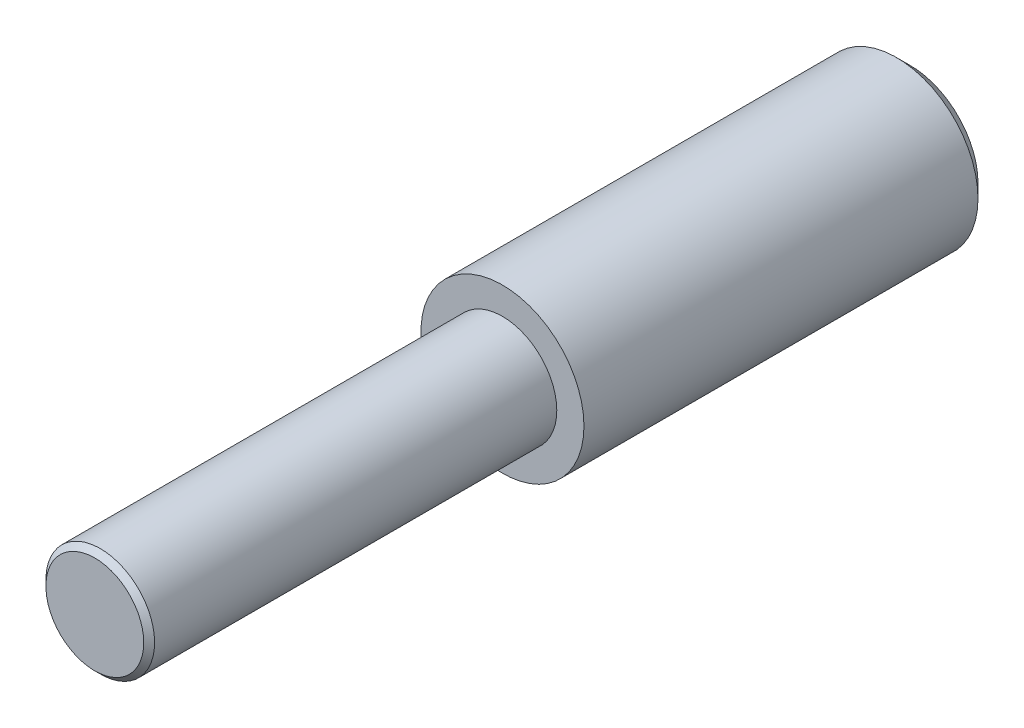
ISO-10303-21;
HEADER;
FILE_DESCRIPTION(('STEP AP214'),'2;1');
FILE_NAME('part.step','',(''),(''),'','','');
FILE_SCHEMA(('AUTOMOTIVE_DESIGN { 1 0 10303 214 1 1 1 1 }'));
ENDSEC;
DATA;
#1=APPLICATION_CONTEXT('core data for automotive mechanical design processes');
#2=APPLICATION_PROTOCOL_DEFINITION('international standard','automotive_design',2000,#1);
#3=PRODUCT_CONTEXT('',#1,'mechanical');
#4=PRODUCT('Part','Part','',(#3));
#5=PRODUCT_RELATED_PRODUCT_CATEGORY('part','',(#4));
#6=PRODUCT_DEFINITION_FORMATION('','',#4);
#7=PRODUCT_DEFINITION_CONTEXT('part definition',#1,'design');
#8=PRODUCT_DEFINITION('design','',#6,#7);
#9=PRODUCT_DEFINITION_SHAPE('','',#8);
#10=(LENGTH_UNIT() NAMED_UNIT(*) SI_UNIT(.MILLI.,.METRE.));
#11=(NAMED_UNIT(*) PLANE_ANGLE_UNIT() SI_UNIT($,.RADIAN.));
#12=(NAMED_UNIT(*) SI_UNIT($,.STERADIAN.) SOLID_ANGLE_UNIT());
#13=UNCERTAINTY_MEASURE_WITH_UNIT(LENGTH_MEASURE(1.E-05),#10,'distance_accuracy_value','');
#14=(GEOMETRIC_REPRESENTATION_CONTEXT(3) GLOBAL_UNCERTAINTY_ASSIGNED_CONTEXT((#13)) GLOBAL_UNIT_ASSIGNED_CONTEXT((#10,
#11,#12)) REPRESENTATION_CONTEXT('',''));
#15=CARTESIAN_POINT('',(0.,0.,0.));
#16=DIRECTION('',(0.,0.,1.));
#17=DIRECTION('',(1.,0.,0.));
#18=AXIS2_PLACEMENT_3D('',#15,#16,#17);
#19=CARTESIAN_POINT('',(-3.88578058618805E-13,4.66293670342566E-12,15.0000000000006));
#20=DIRECTION('',(0.,0.,1.));
#21=DIRECTION('',(1.00000000000008,0.,0.));
#22=AXIS2_PLACEMENT_3D('',#19,#20,#21);
#23=PLANE('',#22);
#24=CARTESIAN_POINT('',(-3.88578058618805E-13,4.66293670342566E-12,15.0000000000006));
#25=DIRECTION('',(0.,0.,1.));
#26=DIRECTION('',(1.00000000000008,0.,0.));
#27=AXIS2_PLACEMENT_3D('',#24,#25,#26);
#28=CIRCLE('',#27,3.);
#29=CARTESIAN_POINT('',(2.99999999999986,4.72638594928299E-12,15.0000000000006));
#30=VERTEX_POINT('',#29);
#31=EDGE_CURVE('E47',#30,#30,#28,.T.);
#32=ORIENTED_EDGE('',*,*,#31,.T.);
#33=EDGE_LOOP('',(#32));
#34=FACE_BOUND('',#33,.T.);
#35=CARTESIAN_POINT('',(-3.88578058618805E-13,4.66293670342566E-12,15.0000000000006));
#36=DIRECTION('',(0.,0.,1.));
#37=DIRECTION('',(1.00000000000008,0.,0.));
#38=AXIS2_PLACEMENT_3D('',#35,#36,#37);
#39=CIRCLE('',#38,2.);
#40=CARTESIAN_POINT('',(1.99999999999978,4.70523620066388E-12,15.0000000000006));
#41=VERTEX_POINT('',#40);
#42=EDGE_CURVE('E50',#41,#41,#39,.T.);
#43=ORIENTED_EDGE('',*,*,#42,.F.);
#44=EDGE_LOOP('',(#43));
#45=FACE_BOUND('',#44,.T.);
#46=ADVANCED_FACE('F27',(#34,#45),#23,.T.);
#47=CARTESIAN_POINT('',(-3.88578058618805E-13,4.66293670342566E-12,15.0000000000006));
#48=DIRECTION('',(0.,0.,-1.));
#49=DIRECTION('',(-1.00000000000008,0.,0.));
#50=AXIS2_PLACEMENT_3D('',#47,#48,#49);
#51=CYLINDRICAL_SURFACE('',#50,3.);
#52=CARTESIAN_POINT('',(-4.98316421231304E-13,4.64682726323685E-12,0.500000000000113));
#53=DIRECTION('',(0.,0.,1.));
#54=DIRECTION('',(1.,0.,0.));
#55=AXIS2_PLACEMENT_3D('',#52,#53,#54);
#56=CIRCLE('',#55,3.);
#57=CARTESIAN_POINT('',(2.9999999999995,4.64682726323685E-12,0.500000000000091));
#58=VERTEX_POINT('',#57);
#59=EDGE_CURVE('E34',#58,#58,#56,.T.);
#60=ORIENTED_EDGE('',*,*,#59,.T.);
#61=EDGE_LOOP('',(#60));
#62=FACE_BOUND('',#61,.T.);
#63=ORIENTED_EDGE('',*,*,#31,.F.);
#64=EDGE_LOOP('',(#63));
#65=FACE_BOUND('',#64,.T.);
#66=ADVANCED_FACE('F29',(#62,#65),#51,.T.);
#67=CARTESIAN_POINT('',(-8.88178419700125E-13,4.88498130835069E-12,7.91033905045424E-13));
#68=DIRECTION('',(0.,0.,1.));
#69=DIRECTION('',(1.00000000000008,0.,0.));
#70=AXIS2_PLACEMENT_3D('',#67,#68,#69);
#71=PLANE('',#70);
#72=CARTESIAN_POINT('',(-5.02100502700696E-13,4.6462717652993E-12,7.91033905045421E-13));
#73=DIRECTION('',(0.,0.,1.));
#74=DIRECTION('',(1.,0.,0.));
#75=AXIS2_PLACEMENT_3D('',#72,#73,#74);
#76=CIRCLE('',#75,2.50000000000068);
#77=CARTESIAN_POINT('',(2.50000000000017,4.6462717652993E-12,7.72113497698434E-13));
#78=VERTEX_POINT('',#77);
#79=EDGE_CURVE('E10',#78,#78,#76,.F.);
#80=ORIENTED_EDGE('',*,*,#79,.T.);
#81=EDGE_LOOP('',(#80));
#82=FACE_BOUND('',#81,.T.);
#83=ADVANCED_FACE('F61',(#82),#71,.F.);
#84=CARTESIAN_POINT('',(-1.11022302462516E-13,3.60822483003176E-12,29.9999999999999));
#85=DIRECTION('',(0.,0.,-1.));
#86=DIRECTION('',(-1.00000000000008,0.,0.));
#87=AXIS2_PLACEMENT_3D('',#84,#85,#86);
#88=CYLINDRICAL_SURFACE('',#87,2.);
#89=CARTESIAN_POINT('',(-1.11022302462516E-13,3.60822483003176E-12,29.7999999999999));
#90=DIRECTION('',(0.,0.,1.));
#91=DIRECTION('',(1.00000000000008,0.,0.));
#92=AXIS2_PLACEMENT_3D('',#89,#90,#91);
#93=CIRCLE('',#92,2.);
#94=CARTESIAN_POINT('',(2.00000000000005,3.65052432726998E-12,29.7999999999999));
#95=VERTEX_POINT('',#94);
#96=EDGE_CURVE('E38',#95,#95,#93,.F.);
#97=ORIENTED_EDGE('',*,*,#96,.T.);
#98=EDGE_LOOP('',(#97));
#99=FACE_BOUND('',#98,.T.);
#100=ORIENTED_EDGE('',*,*,#42,.T.);
#101=EDGE_LOOP('',(#100));
#102=FACE_BOUND('',#101,.T.);
#103=ADVANCED_FACE('F54',(#99,#102),#88,.T.);
#104=CARTESIAN_POINT('',(-1.11022302462516E-13,3.60822483003176E-12,29.9999999999999));
#105=DIRECTION('',(0.,0.,1.));
#106=DIRECTION('',(1.00000000000008,0.,0.));
#107=AXIS2_PLACEMENT_3D('',#104,#105,#106);
#108=PLANE('',#107);
#109=CARTESIAN_POINT('',(-1.11022302462516E-13,3.60822483003176E-12,29.9999999999999));
#110=DIRECTION('',(0.,0.,1.));
#111=DIRECTION('',(1.00000000000008,0.,0.));
#112=AXIS2_PLACEMENT_3D('',#109,#110,#111);
#113=CIRCLE('',#112,1.8);
#114=CARTESIAN_POINT('',(1.80000000000003,3.64629437754616E-12,29.9999999999999));
#115=VERTEX_POINT('',#114);
#116=EDGE_CURVE('E42',#115,#115,#113,.T.);
#117=ORIENTED_EDGE('',*,*,#116,.T.);
#118=EDGE_LOOP('',(#117));
#119=FACE_BOUND('',#118,.T.);
#120=ADVANCED_FACE('F67',(#119),#108,.T.);
#121=CARTESIAN_POINT('',(-1.11022302462516E-13,3.60822483003176E-12,29.9999999999999));
#122=DIRECTION('',(0.,0.,-1.));
#123=DIRECTION('',(-1.00000000000008,0.,0.));
#124=AXIS2_PLACEMENT_3D('',#121,#122,#123);
#125=CONICAL_SURFACE('',#124,1.8,0.785398163397451);
#126=ORIENTED_EDGE('',*,*,#96,.F.);
#127=EDGE_LOOP('',(#126));
#128=FACE_BOUND('',#127,.T.);
#129=ORIENTED_EDGE('',*,*,#116,.F.);
#130=EDGE_LOOP('',(#129));
#131=FACE_BOUND('',#130,.T.);
#132=ADVANCED_FACE('F71',(#128,#131),#125,.T.);
#133=CARTESIAN_POINT('',(-4.98316421231304E-13,4.64682726323685E-12,0.500000000000113));
#134=DIRECTION('',(0.,0.,1.));
#135=DIRECTION('',(1.,0.,0.));
#136=AXIS2_PLACEMENT_3D('',#133,#134,#135);
#137=CONICAL_SURFACE('',#136,3.,0.785398163397451);
#138=ORIENTED_EDGE('',*,*,#79,.F.);
#139=EDGE_LOOP('',(#138));
#140=FACE_BOUND('',#139,.T.);
#141=ORIENTED_EDGE('',*,*,#59,.F.);
#142=EDGE_LOOP('',(#141));
#143=FACE_BOUND('',#142,.T.);
#144=ADVANCED_FACE('F75',(#140,#143),#137,.T.);
#145=CLOSED_SHELL('',(#46,#66,#83,#103,#120,#132,#144));
#146=MANIFOLD_SOLID_BREP('B2',#145);
#147=ADVANCED_BREP_SHAPE_REPRESENTATION('',(#18,#146),#14);
#148=SHAPE_DEFINITION_REPRESENTATION(#9,#147);
ENDSEC;
END-ISO-10303-21;
